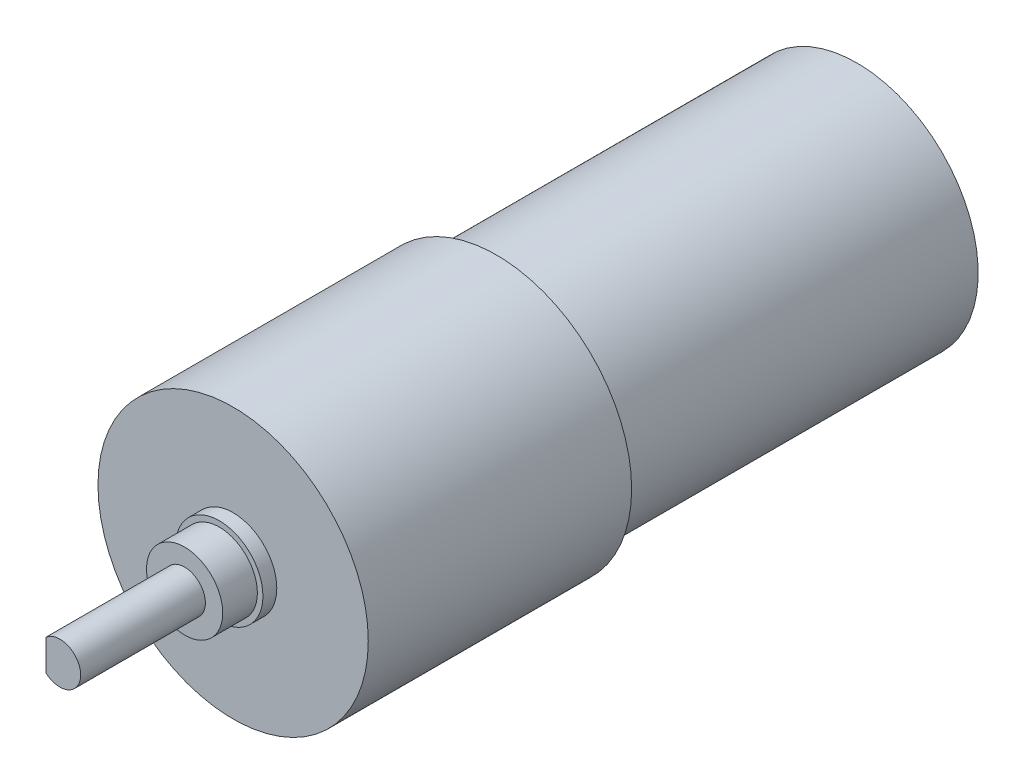
ISO-10303-21;
HEADER;
FILE_DESCRIPTION(('STEP AP214'),'2;1');
FILE_NAME('part.step','',(''),(''),'','','');
FILE_SCHEMA(('AUTOMOTIVE_DESIGN { 1 0 10303 214 1 1 1 1 }'));
ENDSEC;
DATA;
#1=APPLICATION_CONTEXT('core data for automotive mechanical design processes');
#2=APPLICATION_PROTOCOL_DEFINITION('international standard','automotive_design',2000,#1);
#3=PRODUCT_CONTEXT('',#1,'mechanical');
#4=PRODUCT('Part','Part','',(#3));
#5=PRODUCT_RELATED_PRODUCT_CATEGORY('part','',(#4));
#6=PRODUCT_DEFINITION_FORMATION('','',#4);
#7=PRODUCT_DEFINITION_CONTEXT('part definition',#1,'design');
#8=PRODUCT_DEFINITION('design','',#6,#7);
#9=PRODUCT_DEFINITION_SHAPE('','',#8);
#10=(LENGTH_UNIT() NAMED_UNIT(*) SI_UNIT(.MILLI.,.METRE.));
#11=(NAMED_UNIT(*) PLANE_ANGLE_UNIT() SI_UNIT($,.RADIAN.));
#12=(NAMED_UNIT(*) SI_UNIT($,.STERADIAN.) SOLID_ANGLE_UNIT());
#13=UNCERTAINTY_MEASURE_WITH_UNIT(LENGTH_MEASURE(1.E-05),#10,'distance_accuracy_value','');
#14=(GEOMETRIC_REPRESENTATION_CONTEXT(3) GLOBAL_UNCERTAINTY_ASSIGNED_CONTEXT((#13)) GLOBAL_UNIT_ASSIGNED_CONTEXT((#10,
#11,#12)) REPRESENTATION_CONTEXT('',''));
#15=CARTESIAN_POINT('',(0.,0.,0.));
#16=DIRECTION('',(0.,0.,1.));
#17=DIRECTION('',(1.,0.,0.));
#18=AXIS2_PLACEMENT_3D('',#15,#16,#17);
#19=CARTESIAN_POINT('',(0.,0.,48.5));
#20=DIRECTION('',(0.,0.,1.));
#21=DIRECTION('',(1.,0.,0.));
#22=AXIS2_PLACEMENT_3D('',#19,#20,#21);
#23=PLANE('',#22);
#24=CARTESIAN_POINT('',(0.,0.,48.5));
#25=DIRECTION('',(0.,0.,1.));
#26=DIRECTION('',(1.,0.,0.));
#27=AXIS2_PLACEMENT_3D('',#24,#25,#26);
#28=CIRCLE('',#27,2.75);
#29=CARTESIAN_POINT('',(2.75,0.,48.5));
#30=VERTEX_POINT('',#29);
#31=EDGE_CURVE('E83',#30,#30,#28,.T.);
#32=ORIENTED_EDGE('',*,*,#31,.T.);
#33=EDGE_LOOP('',(#32));
#34=FACE_BOUND('',#33,.T.);
#35=DIRECTION('',(0.,-1.,0.));
#36=VECTOR('',#35,1.);
#37=CARTESIAN_POINT('',(-1.,1.1180339887499,48.5));
#38=LINE('',#37,#36);
#39=CARTESIAN_POINT('',(-1.,1.1180339887499,48.5));
#40=VERTEX_POINT('',#39);
#41=CARTESIAN_POINT('',(-1.,-1.1180339887499,48.5));
#42=VERTEX_POINT('',#41);
#43=EDGE_CURVE('E67',#40,#42,#38,.T.);
#44=ORIENTED_EDGE('',*,*,#43,.F.);
#45=CARTESIAN_POINT('',(0.,0.,48.5));
#46=DIRECTION('',(0.,0.,1.));
#47=DIRECTION('',(1.,0.,0.));
#48=AXIS2_PLACEMENT_3D('',#45,#46,#47);
#49=CIRCLE('',#48,1.5);
#50=EDGE_CURVE('E52',#42,#40,#49,.T.);
#51=ORIENTED_EDGE('',*,*,#50,.F.);
#52=EDGE_LOOP('',(#44,#51));
#53=FACE_BOUND('',#52,.T.);
#54=ADVANCED_FACE('F37',(#34,#53),#23,.T.);
#55=CARTESIAN_POINT('',(0.,0.,46.));
#56=DIRECTION('',(0.,0.,1.));
#57=DIRECTION('',(1.,0.,0.));
#58=AXIS2_PLACEMENT_3D('',#55,#56,#57);
#59=PLANE('',#58);
#60=CARTESIAN_POINT('',(0.,0.,46.));
#61=DIRECTION('',(0.,0.,1.));
#62=DIRECTION('',(1.,0.,0.));
#63=AXIS2_PLACEMENT_3D('',#60,#61,#62);
#64=CIRCLE('',#63,3.15);
#65=CARTESIAN_POINT('',(3.15,0.,46.));
#66=VERTEX_POINT('',#65);
#67=EDGE_CURVE('E89',#66,#66,#64,.T.);
#68=ORIENTED_EDGE('',*,*,#67,.T.);
#69=EDGE_LOOP('',(#68));
#70=FACE_BOUND('',#69,.T.);
#71=CARTESIAN_POINT('',(0.,0.,46.));
#72=DIRECTION('',(0.,0.,1.));
#73=DIRECTION('',(1.,0.,0.));
#74=AXIS2_PLACEMENT_3D('',#71,#72,#73);
#75=CIRCLE('',#74,2.75);
#76=CARTESIAN_POINT('',(2.75,0.,46.));
#77=VERTEX_POINT('',#76);
#78=EDGE_CURVE('E82',#77,#77,#75,.T.);
#79=ORIENTED_EDGE('',*,*,#78,.F.);
#80=EDGE_LOOP('',(#79));
#81=FACE_BOUND('',#80,.T.);
#82=ADVANCED_FACE('F121',(#70,#81),#59,.T.);
#83=CARTESIAN_POINT('',(0.,0.,45.));
#84=DIRECTION('',(0.,0.,1.));
#85=DIRECTION('',(1.,0.,0.));
#86=AXIS2_PLACEMENT_3D('',#83,#84,#85);
#87=PLANE('',#86);
#88=CARTESIAN_POINT('',(0.,0.,45.));
#89=DIRECTION('',(0.,0.,1.));
#90=DIRECTION('',(1.,0.,0.));
#91=AXIS2_PLACEMENT_3D('',#88,#89,#90);
#92=CIRCLE('',#91,9.75);
#93=CARTESIAN_POINT('',(9.75,0.,45.));
#94=VERTEX_POINT('',#93);
#95=EDGE_CURVE('E95',#94,#94,#92,.T.);
#96=ORIENTED_EDGE('',*,*,#95,.T.);
#97=EDGE_LOOP('',(#96));
#98=FACE_BOUND('',#97,.T.);
#99=CARTESIAN_POINT('',(0.,0.,45.));
#100=DIRECTION('',(0.,0.,1.));
#101=DIRECTION('',(1.,0.,0.));
#102=AXIS2_PLACEMENT_3D('',#99,#100,#101);
#103=CIRCLE('',#102,3.15);
#104=CARTESIAN_POINT('',(3.15,0.,45.));
#105=VERTEX_POINT('',#104);
#106=EDGE_CURVE('E86',#105,#105,#103,.T.);
#107=ORIENTED_EDGE('',*,*,#106,.F.);
#108=EDGE_LOOP('',(#107));
#109=FACE_BOUND('',#108,.T.);
#110=ADVANCED_FACE('F112',(#98,#109),#87,.T.);
#111=CARTESIAN_POINT('',(0.,0.,26.));
#112=DIRECTION('',(0.,0.,-1.));
#113=DIRECTION('',(-1.,0.,0.));
#114=AXIS2_PLACEMENT_3D('',#111,#112,#113);
#115=CYLINDRICAL_SURFACE('',#114,8.75);
#116=CARTESIAN_POINT('',(0.,0.,26.));
#117=DIRECTION('',(0.,0.,1.));
#118=DIRECTION('',(1.,0.,0.));
#119=AXIS2_PLACEMENT_3D('',#116,#117,#118);
#120=CIRCLE('',#119,8.75);
#121=CARTESIAN_POINT('',(-8.75,0.,26.));
#122=VERTEX_POINT('',#121);
#123=EDGE_CURVE('E11',#122,#122,#120,.T.);
#124=CARTESIAN_POINT('',(0.,0.,0.));
#125=DIRECTION('',(0.,0.,1.));
#126=DIRECTION('',(1.,0.,0.));
#127=AXIS2_PLACEMENT_3D('',#124,#125,#126);
#128=CIRCLE('',#127,8.75);
#129=CARTESIAN_POINT('',(-8.75,0.,0.));
#130=VERTEX_POINT('',#129);
#131=EDGE_CURVE('E41',#130,#130,#128,.T.);
#132=CARTESIAN_POINT('',(-8.75,0.,26.));
#133=CARTESIAN_POINT('',(-8.75,0.,25.7291666666667));
#134=CARTESIAN_POINT('',(-8.75,0.,25.4583333333333));
#135=CARTESIAN_POINT('',(-8.75,0.,24.9166666666667));
#136=CARTESIAN_POINT('',(-8.75,0.,24.6458333333333));
#137=CARTESIAN_POINT('',(-8.75,0.,24.1041666666667));
#138=CARTESIAN_POINT('',(-8.75,0.,23.8333333333333));
#139=CARTESIAN_POINT('',(-8.75,0.,23.2916666666667));
#140=CARTESIAN_POINT('',(-8.75,0.,23.0208333333333));
#141=CARTESIAN_POINT('',(-8.75,0.,22.4791666666667));
#142=CARTESIAN_POINT('',(-8.75,0.,22.2083333333333));
#143=CARTESIAN_POINT('',(-8.75,0.,21.6666666666667));
#144=CARTESIAN_POINT('',(-8.75,0.,21.3958333333333));
#145=CARTESIAN_POINT('',(-8.75,0.,20.8541666666667));
#146=CARTESIAN_POINT('',(-8.75,0.,20.5833333333333));
#147=CARTESIAN_POINT('',(-8.75,0.,20.0416666666667));
#148=CARTESIAN_POINT('',(-8.75,0.,19.7708333333333));
#149=CARTESIAN_POINT('',(-8.75,0.,19.2291666666667));
#150=CARTESIAN_POINT('',(-8.75,0.,18.9583333333333));
#151=CARTESIAN_POINT('',(-8.75,0.,18.4166666666667));
#152=CARTESIAN_POINT('',(-8.75,0.,18.1458333333333));
#153=CARTESIAN_POINT('',(-8.75,0.,17.6041666666667));
#154=CARTESIAN_POINT('',(-8.75,0.,17.3333333333333));
#155=CARTESIAN_POINT('',(-8.75,0.,16.7916666666667));
#156=CARTESIAN_POINT('',(-8.75,0.,16.5208333333333));
#157=CARTESIAN_POINT('',(-8.75,0.,15.9791666666667));
#158=CARTESIAN_POINT('',(-8.75,0.,15.7083333333333));
#159=CARTESIAN_POINT('',(-8.75,0.,15.1666666666667));
#160=CARTESIAN_POINT('',(-8.75,0.,14.8958333333333));
#161=CARTESIAN_POINT('',(-8.75,0.,14.3541666666667));
#162=CARTESIAN_POINT('',(-8.75,0.,14.0833333333333));
#163=CARTESIAN_POINT('',(-8.75,0.,13.5416666666667));
#164=CARTESIAN_POINT('',(-8.75,0.,13.2708333333333));
#165=CARTESIAN_POINT('',(-8.75,0.,12.7291666666667));
#166=CARTESIAN_POINT('',(-8.75,0.,12.4583333333333));
#167=CARTESIAN_POINT('',(-8.75,0.,11.9166666666667));
#168=CARTESIAN_POINT('',(-8.75,0.,11.6458333333333));
#169=CARTESIAN_POINT('',(-8.75,0.,11.1041666666667));
#170=CARTESIAN_POINT('',(-8.75,0.,10.8333333333333));
#171=CARTESIAN_POINT('',(-8.75,0.,10.2916666666667));
#172=CARTESIAN_POINT('',(-8.75,0.,10.0208333333333));
#173=CARTESIAN_POINT('',(-8.75,0.,9.47916666666667));
#174=CARTESIAN_POINT('',(-8.75,0.,9.20833333333333));
#175=CARTESIAN_POINT('',(-8.75,0.,8.66666666666667));
#176=CARTESIAN_POINT('',(-8.75,0.,8.39583333333333));
#177=CARTESIAN_POINT('',(-8.75,0.,7.85416666666667));
#178=CARTESIAN_POINT('',(-8.75,0.,7.58333333333333));
#179=CARTESIAN_POINT('',(-8.75,0.,7.04166666666667));
#180=CARTESIAN_POINT('',(-8.75,0.,6.77083333333333));
#181=CARTESIAN_POINT('',(-8.75,0.,6.22916666666667));
#182=CARTESIAN_POINT('',(-8.75,0.,5.95833333333333));
#183=CARTESIAN_POINT('',(-8.75,0.,5.41666666666667));
#184=CARTESIAN_POINT('',(-8.75,0.,5.14583333333333));
#185=CARTESIAN_POINT('',(-8.75,0.,4.60416666666667));
#186=CARTESIAN_POINT('',(-8.75,0.,4.33333333333333));
#187=CARTESIAN_POINT('',(-8.75,0.,3.79166666666667));
#188=CARTESIAN_POINT('',(-8.75,0.,3.52083333333333));
#189=CARTESIAN_POINT('',(-8.75,0.,2.97916666666667));
#190=CARTESIAN_POINT('',(-8.75,0.,2.70833333333333));
#191=CARTESIAN_POINT('',(-8.75,0.,2.16666666666667));
#192=CARTESIAN_POINT('',(-8.75,0.,1.89583333333333));
#193=CARTESIAN_POINT('',(-8.75,0.,1.35416666666667));
#194=CARTESIAN_POINT('',(-8.75,0.,1.08333333333333));
#195=CARTESIAN_POINT('',(-8.75,0.,0.541666666666667));
#196=CARTESIAN_POINT('',(-8.75,0.,0.270833333333334));
#197=CARTESIAN_POINT('',(-8.75,0.,0.));
#198=B_SPLINE_CURVE_WITH_KNOTS('',3,(#132,#133,#134,#135,#136,#137,#138,#139,#140,#141,#142,
#143,#144,#145,#146,#147,#148,#149,#150,#151,#152,#153,#154,#155,#156,#157,#158,#159,#160,#161,
#162,#163,#164,#165,#166,#167,#168,#169,#170,#171,#172,#173,#174,#175,#176,#177,#178,#179,#180,
#181,#182,#183,#184,#185,#186,#187,#188,#189,#190,#191,#192,#193,#194,#195,#196,#197),
.UNSPECIFIED.,.F.,.F.,(4,2,2,2,2,2,2,2,2,2,2,2,2,2,2,2,2,2,2,2,2,2,2,2,2,2,2,2,2,2,2,2,4),(0.,
0.812499999999997,1.625,2.4375,3.25,4.0625,4.875,5.6875,6.5,7.3125,8.125,8.93749999999999,
9.74999999999999,10.5625,11.375,12.1875,13.,13.8125,14.625,15.4375,16.25,17.0625,17.875,18.6875,
19.5,20.3125,21.125,21.9375,22.75,23.5625,24.375,25.1875,26.),.UNSPECIFIED.);
#199=EDGE_CURVE('BSEAM39',#122,#130,#198,.T.);
#200=ORIENTED_EDGE('',*,*,#123,.F.);
#201=ORIENTED_EDGE('',*,*,#131,.T.);
#202=ORIENTED_EDGE('',*,*,#199,.T.);
#203=ORIENTED_EDGE('',*,*,#199,.F.);
#204=EDGE_LOOP('',(#200,#202,#201,#203));
#205=FACE_BOUND('',#204,.T.);
#206=ADVANCED_FACE('F39',(#205),#115,.T.);
#207=CARTESIAN_POINT('',(0.,0.,0.));
#208=DIRECTION('',(0.,0.,1.));
#209=DIRECTION('',(1.,0.,0.));
#210=AXIS2_PLACEMENT_3D('',#207,#208,#209);
#211=PLANE('',#210);
#212=ORIENTED_EDGE('',*,*,#131,.F.);
#213=EDGE_LOOP('',(#212));
#214=FACE_BOUND('',#213,.T.);
#215=ADVANCED_FACE('F106',(#214),#211,.F.);
#216=CARTESIAN_POINT('',(0.,0.,26.));
#217=DIRECTION('',(0.,0.,1.));
#218=DIRECTION('',(1.,0.,0.));
#219=AXIS2_PLACEMENT_3D('',#216,#217,#218);
#220=PLANE('',#219);
#221=CARTESIAN_POINT('',(0.,0.,26.));
#222=DIRECTION('',(0.,0.,1.));
#223=DIRECTION('',(1.,0.,0.));
#224=AXIS2_PLACEMENT_3D('',#221,#222,#223);
#225=CIRCLE('',#224,9.75);
#226=CARTESIAN_POINT('',(9.75,0.,26.));
#227=VERTEX_POINT('',#226);
#228=EDGE_CURVE('E92',#227,#227,#225,.T.);
#229=ORIENTED_EDGE('',*,*,#228,.F.);
#230=EDGE_LOOP('',(#229));
#231=FACE_BOUND('',#230,.T.);
#232=ORIENTED_EDGE('',*,*,#123,.T.);
#233=EDGE_LOOP('',(#232));
#234=FACE_BOUND('',#233,.T.);
#235=ADVANCED_FACE('F103',(#231,#234),#220,.F.);
#236=CARTESIAN_POINT('',(0.,0.,45.));
#237=DIRECTION('',(0.,0.,-1.));
#238=DIRECTION('',(-1.,0.,0.));
#239=AXIS2_PLACEMENT_3D('',#236,#237,#238);
#240=CYLINDRICAL_SURFACE('',#239,9.75);
#241=ORIENTED_EDGE('',*,*,#95,.F.);
#242=EDGE_LOOP('',(#241));
#243=FACE_BOUND('',#242,.T.);
#244=ORIENTED_EDGE('',*,*,#228,.T.);
#245=EDGE_LOOP('',(#244));
#246=FACE_BOUND('',#245,.T.);
#247=ADVANCED_FACE('F101',(#243,#246),#240,.T.);
#248=CARTESIAN_POINT('',(0.,0.,46.));
#249=DIRECTION('',(0.,0.,-1.));
#250=DIRECTION('',(-1.,0.,0.));
#251=AXIS2_PLACEMENT_3D('',#248,#249,#250);
#252=CYLINDRICAL_SURFACE('',#251,3.15);
#253=ORIENTED_EDGE('',*,*,#67,.F.);
#254=EDGE_LOOP('',(#253));
#255=FACE_BOUND('',#254,.T.);
#256=ORIENTED_EDGE('',*,*,#106,.T.);
#257=EDGE_LOOP('',(#256));
#258=FACE_BOUND('',#257,.T.);
#259=ADVANCED_FACE('F134',(#255,#258),#252,.T.);
#260=CARTESIAN_POINT('',(0.,0.,48.5));
#261=DIRECTION('',(0.,0.,-1.));
#262=DIRECTION('',(-1.,0.,0.));
#263=AXIS2_PLACEMENT_3D('',#260,#261,#262);
#264=CYLINDRICAL_SURFACE('',#263,2.75);
#265=ORIENTED_EDGE('',*,*,#31,.F.);
#266=EDGE_LOOP('',(#265));
#267=FACE_BOUND('',#266,.T.);
#268=ORIENTED_EDGE('',*,*,#78,.T.);
#269=EDGE_LOOP('',(#268));
#270=FACE_BOUND('',#269,.T.);
#271=ADVANCED_FACE('F132',(#267,#270),#264,.T.);
#272=CARTESIAN_POINT('',(0.,0.,57.5));
#273=DIRECTION('',(0.,0.,-1.));
#274=DIRECTION('',(-1.,0.,0.));
#275=AXIS2_PLACEMENT_3D('',#272,#273,#274);
#276=CYLINDRICAL_SURFACE('',#275,1.5);
#277=ORIENTED_EDGE('',*,*,#50,.T.);
#278=DIRECTION('',(0.,0.,-1.));
#279=VECTOR('',#278,1.);
#280=CARTESIAN_POINT('',(-1.,1.1180339887499,57.5));
#281=LINE('',#280,#279);
#282=CARTESIAN_POINT('',(-1.,1.1180339887499,57.5));
#283=VERTEX_POINT('',#282);
#284=EDGE_CURVE('E71',#283,#40,#281,.T.);
#285=ORIENTED_EDGE('',*,*,#284,.F.);
#286=CARTESIAN_POINT('',(0.,0.,57.5));
#287=DIRECTION('',(0.,0.,1.));
#288=DIRECTION('',(1.,0.,0.));
#289=AXIS2_PLACEMENT_3D('',#286,#287,#288);
#290=CIRCLE('',#289,1.5);
#291=CARTESIAN_POINT('',(-1.,-1.1180339887499,57.5));
#292=VERTEX_POINT('',#291);
#293=EDGE_CURVE('E73',#292,#283,#290,.T.);
#294=ORIENTED_EDGE('',*,*,#293,.F.);
#295=DIRECTION('',(0.,0.,-1.));
#296=VECTOR('',#295,1.);
#297=CARTESIAN_POINT('',(-1.,-1.1180339887499,57.5));
#298=LINE('',#297,#296);
#299=EDGE_CURVE('E69',#292,#42,#298,.T.);
#300=ORIENTED_EDGE('',*,*,#299,.T.);
#301=EDGE_LOOP('',(#277,#285,#294,#300));
#302=FACE_BOUND('',#301,.T.);
#303=ADVANCED_FACE('F75',(#302),#276,.T.);
#304=CARTESIAN_POINT('',(-1.,1.1180339887499,57.5));
#305=DIRECTION('',(1.,0.,0.));
#306=DIRECTION('',(0.,0.,-1.));
#307=AXIS2_PLACEMENT_3D('',#304,#305,#306);
#308=PLANE('',#307);
#309=ORIENTED_EDGE('',*,*,#43,.T.);
#310=ORIENTED_EDGE('',*,*,#299,.F.);
#311=DIRECTION('',(0.,-1.,0.));
#312=VECTOR('',#311,1.);
#313=CARTESIAN_POINT('',(-1.,1.1180339887499,57.5));
#314=LINE('',#313,#312);
#315=EDGE_CURVE('E60',#283,#292,#314,.T.);
#316=ORIENTED_EDGE('',*,*,#315,.F.);
#317=ORIENTED_EDGE('',*,*,#284,.T.);
#318=EDGE_LOOP('',(#309,#310,#316,#317));
#319=FACE_BOUND('',#318,.T.);
#320=ADVANCED_FACE('F68',(#319),#308,.F.);
#321=CARTESIAN_POINT('',(0.,0.,57.5));
#322=DIRECTION('',(0.,0.,1.));
#323=DIRECTION('',(1.,0.,0.));
#324=AXIS2_PLACEMENT_3D('',#321,#322,#323);
#325=PLANE('',#324);
#326=ORIENTED_EDGE('',*,*,#293,.T.);
#327=ORIENTED_EDGE('',*,*,#315,.T.);
#328=EDGE_LOOP('',(#326,#327));
#329=FACE_BOUND('',#328,.T.);
#330=ADVANCED_FACE('F173',(#329),#325,.T.);
#331=CLOSED_SHELL('',(#54,#82,#110,#206,#215,#235,#247,#259,#271,#303,#320,#330));
#332=MANIFOLD_SOLID_BREP('B2',#331);
#333=ADVANCED_BREP_SHAPE_REPRESENTATION('',(#18,#332),#14);
#334=SHAPE_DEFINITION_REPRESENTATION(#9,#333);
ENDSEC;
END-ISO-10303-21;
